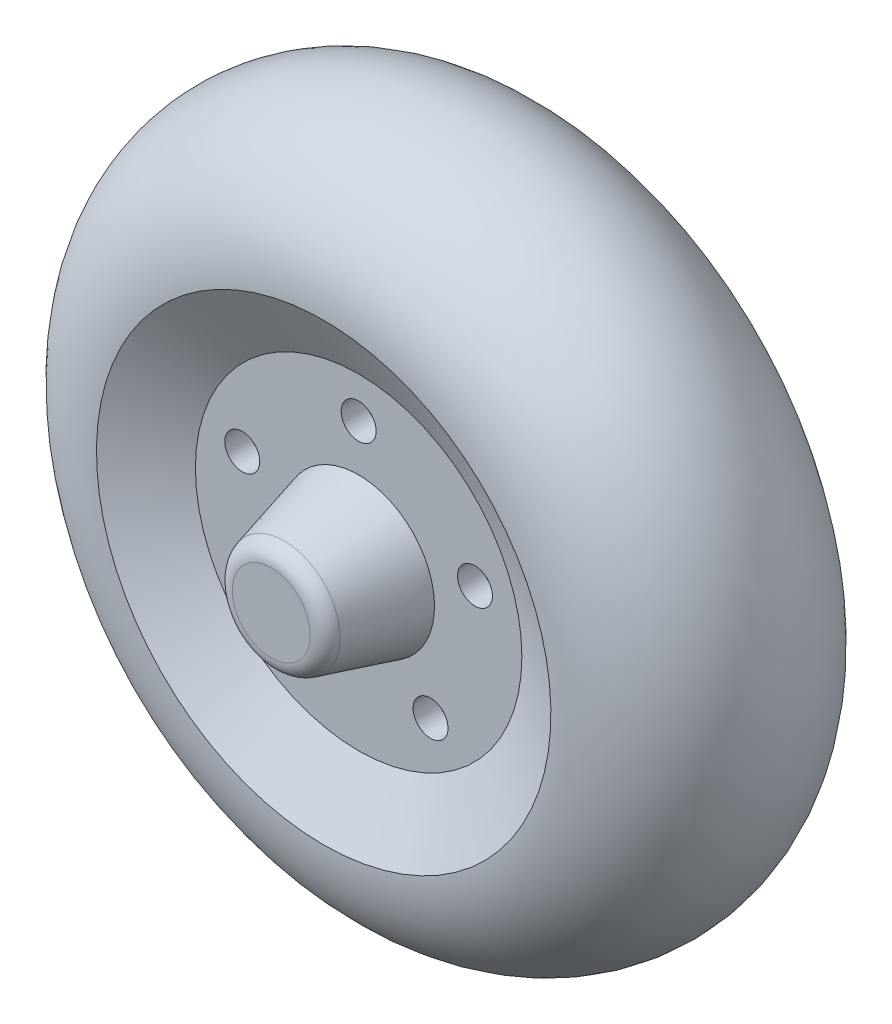
ISO-10303-21;
HEADER;
FILE_DESCRIPTION(('STEP AP214'),'2;1');
FILE_NAME('part.step','',(''),(''),'','','');
FILE_SCHEMA(('AUTOMOTIVE_DESIGN { 1 0 10303 214 1 1 1 1 }'));
ENDSEC;
DATA;
#1=APPLICATION_CONTEXT('core data for automotive mechanical design processes');
#2=APPLICATION_PROTOCOL_DEFINITION('international standard','automotive_design',2000,#1);
#3=PRODUCT_CONTEXT('',#1,'mechanical');
#4=PRODUCT('Part','Part','',(#3));
#5=PRODUCT_RELATED_PRODUCT_CATEGORY('part','',(#4));
#6=PRODUCT_DEFINITION_FORMATION('','',#4);
#7=PRODUCT_DEFINITION_CONTEXT('part definition',#1,'design');
#8=PRODUCT_DEFINITION('design','',#6,#7);
#9=PRODUCT_DEFINITION_SHAPE('','',#8);
#10=(LENGTH_UNIT() NAMED_UNIT(*) SI_UNIT(.MILLI.,.METRE.));
#11=(NAMED_UNIT(*) PLANE_ANGLE_UNIT() SI_UNIT($,.RADIAN.));
#12=(NAMED_UNIT(*) SI_UNIT($,.STERADIAN.) SOLID_ANGLE_UNIT());
#13=UNCERTAINTY_MEASURE_WITH_UNIT(LENGTH_MEASURE(1.E-05),#10,'distance_accuracy_value','');
#14=(GEOMETRIC_REPRESENTATION_CONTEXT(3) GLOBAL_UNCERTAINTY_ASSIGNED_CONTEXT((#13)) GLOBAL_UNIT_ASSIGNED_CONTEXT((#10,
#11,#12)) REPRESENTATION_CONTEXT('',''));
#15=CARTESIAN_POINT('',(0.,0.,0.));
#16=DIRECTION('',(0.,0.,1.));
#17=DIRECTION('',(1.,0.,0.));
#18=AXIS2_PLACEMENT_3D('',#15,#16,#17);
#19=CARTESIAN_POINT('',(0.,0.,25.));
#20=DIRECTION('',(0.,0.,-1.));
#21=DIRECTION('',(0.,1.,0.));
#22=AXIS2_PLACEMENT_3D('',#19,#20,#21);
#23=CONICAL_SURFACE('',#22,21.6987298107782,0.261799387799153);
#24=CARTESIAN_POINT('',(0.,0.,46.2940952255126));
#25=DIRECTION('',(0.,0.,1.));
#26=DIRECTION('',(0.,-1.,0.));
#27=AXIS2_PLACEMENT_3D('',#24,#25,#26);
#28=CIRCLE('',#27,15.9929941915506);
#29=CARTESIAN_POINT('',(0.,-15.9929941915506,46.2940952255126));
#30=VERTEX_POINT('',#29);
#31=EDGE_CURVE('E56',#30,#30,#28,.F.);
#32=ORIENTED_EDGE('',*,*,#31,.T.);
#33=EDGE_LOOP('',(#32));
#34=FACE_BOUND('',#33,.T.);
#35=CARTESIAN_POINT('',(0.,0.,25.));
#36=DIRECTION('',(0.,0.,1.));
#37=DIRECTION('',(0.,-1.,0.));
#38=AXIS2_PLACEMENT_3D('',#35,#36,#37);
#39=CIRCLE('',#38,21.6987298107782);
#40=CARTESIAN_POINT('',(0.,-21.6987298107782,25.));
#41=VERTEX_POINT('',#40);
#42=EDGE_CURVE('E117',#41,#41,#39,.T.);
#43=ORIENTED_EDGE('',*,*,#42,.T.);
#44=EDGE_LOOP('',(#43));
#45=FACE_BOUND('',#44,.T.);
#46=ADVANCED_FACE('F41',(#34,#45),#23,.T.);
#47=CARTESIAN_POINT('',(0.,15.,50.));
#48=DIRECTION('',(0.,0.,-1.));
#49=DIRECTION('',(0.,1.,0.));
#50=AXIS2_PLACEMENT_3D('',#47,#48,#49);
#51=PLANE('',#50);
#52=CARTESIAN_POINT('',(0.,0.,50.));
#53=DIRECTION('',(0.,0.,-1.));
#54=DIRECTION('',(0.,1.,0.));
#55=AXIS2_PLACEMENT_3D('',#52,#53,#54);
#56=CIRCLE('',#55,11.1633650601053);
#57=CARTESIAN_POINT('',(0.,11.1633650601052,50.));
#58=VERTEX_POINT('',#57);
#59=EDGE_CURVE('E173',#58,#58,#56,.F.);
#60=ORIENTED_EDGE('',*,*,#59,.T.);
#61=EDGE_LOOP('',(#60));
#62=FACE_BOUND('',#61,.T.);
#63=ADVANCED_FACE('F188',(#62),#51,.F.);
#64=CARTESIAN_POINT('',(0.,15.,-50.));
#65=DIRECTION('',(0.,0.,1.));
#66=DIRECTION('',(0.,-1.,0.));
#67=AXIS2_PLACEMENT_3D('',#64,#65,#66);
#68=PLANE('',#67);
#69=CARTESIAN_POINT('',(0.,0.,-50.));
#70=DIRECTION('',(0.,0.,1.));
#71=DIRECTION('',(0.,-1.,0.));
#72=AXIS2_PLACEMENT_3D('',#69,#70,#71);
#73=CIRCLE('',#72,11.1633650601052);
#74=CARTESIAN_POINT('',(0.,-11.1633650601052,-50.));
#75=VERTEX_POINT('',#74);
#76=EDGE_CURVE('E10',#75,#75,#73,.F.);
#77=ORIENTED_EDGE('',*,*,#76,.T.);
#78=EDGE_LOOP('',(#77));
#79=FACE_BOUND('',#78,.T.);
#80=ADVANCED_FACE('F190',(#79),#68,.F.);
#81=CARTESIAN_POINT('',(0.,0.,-50.));
#82=DIRECTION('',(0.,0.,1.));
#83=DIRECTION('',(0.,-1.,0.));
#84=AXIS2_PLACEMENT_3D('',#81,#82,#83);
#85=CONICAL_SURFACE('',#84,15.,0.261799387799154);
#86=CARTESIAN_POINT('',(0.,0.,-46.2940952255126));
#87=DIRECTION('',(0.,0.,-1.));
#88=DIRECTION('',(0.,1.,0.));
#89=AXIS2_PLACEMENT_3D('',#86,#87,#88);
#90=CIRCLE('',#89,15.9929941915505);
#91=CARTESIAN_POINT('',(0.,15.9929941915506,-46.2940952255126));
#92=VERTEX_POINT('',#91);
#93=EDGE_CURVE('E50',#92,#92,#90,.F.);
#94=ORIENTED_EDGE('',*,*,#93,.T.);
#95=EDGE_LOOP('',(#94));
#96=FACE_BOUND('',#95,.T.);
#97=CARTESIAN_POINT('',(0.,0.,-25.));
#98=DIRECTION('',(0.,0.,1.));
#99=DIRECTION('',(0.,-1.,0.));
#100=AXIS2_PLACEMENT_3D('',#97,#98,#99);
#101=CIRCLE('',#100,21.6987298107782);
#102=CARTESIAN_POINT('',(0.,-21.6987298107781,-25.));
#103=VERTEX_POINT('',#102);
#104=EDGE_CURVE('E137',#103,#103,#101,.T.);
#105=ORIENTED_EDGE('',*,*,#104,.F.);
#106=EDGE_LOOP('',(#105));
#107=FACE_BOUND('',#106,.T.);
#108=ADVANCED_FACE('F196',(#96,#107),#85,.T.);
#109=CARTESIAN_POINT('',(0.,46.6987298107782,-25.));
#110=DIRECTION('',(0.,0.,1.));
#111=DIRECTION('',(0.,-1.,0.));
#112=AXIS2_PLACEMENT_3D('',#109,#110,#111);
#113=PLANE('',#112);
#114=CARTESIAN_POINT('',(0.,35.,-25.));
#115=DIRECTION('',(0.,0.,1.));
#116=DIRECTION('',(0.,-1.,0.));
#117=AXIS2_PLACEMENT_3D('',#114,#115,#116);
#118=CIRCLE('',#117,5.);
#119=CARTESIAN_POINT('',(0.,30.,-25.));
#120=VERTEX_POINT('',#119);
#121=EDGE_CURVE('E113',#120,#120,#118,.T.);
#122=ORIENTED_EDGE('',*,*,#121,.T.);
#123=EDGE_LOOP('',(#122));
#124=FACE_BOUND('',#123,.T.);
#125=CARTESIAN_POINT('',(-33.2869780703304,10.8155948031231,-25.));
#126=DIRECTION('',(0.,0.,1.));
#127=DIRECTION('',(0.,-1.,0.));
#128=AXIS2_PLACEMENT_3D('',#125,#126,#127);
#129=CIRCLE('',#128,5.);
#130=CARTESIAN_POINT('',(-33.2869780703304,5.81559480312309,-25.));
#131=VERTEX_POINT('',#130);
#132=EDGE_CURVE('E101',#131,#131,#129,.T.);
#133=ORIENTED_EDGE('',*,*,#132,.T.);
#134=EDGE_LOOP('',(#133));
#135=FACE_BOUND('',#134,.T.);
#136=CARTESIAN_POINT('',(-20.5724838302364,-28.3155948031233,-25.));
#137=DIRECTION('',(0.,0.,1.));
#138=DIRECTION('',(0.,-1.,0.));
#139=AXIS2_PLACEMENT_3D('',#136,#137,#138);
#140=CIRCLE('',#139,5.);
#141=CARTESIAN_POINT('',(-20.5724838302364,-33.3155948031233,-25.));
#142=VERTEX_POINT('',#141);
#143=EDGE_CURVE('E80',#142,#142,#140,.T.);
#144=ORIENTED_EDGE('',*,*,#143,.T.);
#145=EDGE_LOOP('',(#144));
#146=FACE_BOUND('',#145,.T.);
#147=CARTESIAN_POINT('',(20.5724838302368,-28.315594803123,-25.));
#148=DIRECTION('',(0.,0.,1.));
#149=DIRECTION('',(0.,-1.,0.));
#150=AXIS2_PLACEMENT_3D('',#147,#148,#149);
#151=CIRCLE('',#150,5.);
#152=CARTESIAN_POINT('',(20.5724838302368,-33.315594803123,-25.));
#153=VERTEX_POINT('',#152);
#154=EDGE_CURVE('E75',#153,#153,#151,.T.);
#155=ORIENTED_EDGE('',*,*,#154,.T.);
#156=EDGE_LOOP('',(#155));
#157=FACE_BOUND('',#156,.T.);
#158=CARTESIAN_POINT('',(33.2869780703303,10.8155948031236,-25.));
#159=DIRECTION('',(0.,0.,1.));
#160=DIRECTION('',(0.,-1.,0.));
#161=AXIS2_PLACEMENT_3D('',#158,#159,#160);
#162=CIRCLE('',#161,5.);
#163=CARTESIAN_POINT('',(33.2869780703303,5.81559480312356,-25.));
#164=VERTEX_POINT('',#163);
#165=EDGE_CURVE('E70',#164,#164,#162,.T.);
#166=ORIENTED_EDGE('',*,*,#165,.T.);
#167=EDGE_LOOP('',(#166));
#168=FACE_BOUND('',#167,.T.);
#169=CARTESIAN_POINT('',(0.,0.,-25.));
#170=DIRECTION('',(0.,0.,1.));
#171=DIRECTION('',(0.,-1.,0.));
#172=AXIS2_PLACEMENT_3D('',#169,#170,#171);
#173=CIRCLE('',#172,46.6987298107782);
#174=CARTESIAN_POINT('',(0.,-46.6987298107782,-25.));
#175=VERTEX_POINT('',#174);
#176=EDGE_CURVE('E133',#175,#175,#173,.T.);
#177=ORIENTED_EDGE('',*,*,#176,.F.);
#178=EDGE_LOOP('',(#177));
#179=FACE_BOUND('',#178,.T.);
#180=ORIENTED_EDGE('',*,*,#104,.T.);
#181=EDGE_LOOP('',(#180));
#182=FACE_BOUND('',#181,.T.);
#183=ADVANCED_FACE('F239',(#124,#135,#146,#157,#168,#179,#182),#113,.F.);
#184=CARTESIAN_POINT('',(0.,0.,-25.));
#185=DIRECTION('',(0.,0.,-1.));
#186=DIRECTION('',(0.,1.,0.));
#187=AXIS2_PLACEMENT_3D('',#184,#185,#186);
#188=CONICAL_SURFACE('',#187,46.6987298107782,1.07071340709068);
#189=CARTESIAN_POINT('',(0.,0.,-35.));
#190=DIRECTION('',(0.,0.,1.));
#191=DIRECTION('',(0.,-1.,0.));
#192=AXIS2_PLACEMENT_3D('',#189,#190,#191);
#193=CIRCLE('',#192,65.);
#194=CARTESIAN_POINT('',(0.,-65.,-35.0000000000001));
#195=VERTEX_POINT('',#194);
#196=EDGE_CURVE('E129',#195,#195,#193,.T.);
#197=ORIENTED_EDGE('',*,*,#196,.F.);
#198=EDGE_LOOP('',(#197));
#199=FACE_BOUND('',#198,.T.);
#200=ORIENTED_EDGE('',*,*,#176,.T.);
#201=EDGE_LOOP('',(#200));
#202=FACE_BOUND('',#201,.T.);
#203=ADVANCED_FACE('F243',(#199,#202),#188,.F.);
#204=CARTESIAN_POINT('',(0.,0.,0.));
#205=DIRECTION('',(0.,0.,1.));
#206=DIRECTION('',(0.,-1.,0.));
#207=AXIS2_PLACEMENT_3D('',#204,#205,#206);
#208=TOROIDAL_SURFACE('',#207,65.,35.);
#209=CARTESIAN_POINT('',(0.,0.,34.9999999999999));
#210=DIRECTION('',(0.,0.,1.));
#211=DIRECTION('',(0.,-1.,0.));
#212=AXIS2_PLACEMENT_3D('',#209,#210,#211);
#213=CIRCLE('',#212,65.);
#214=CARTESIAN_POINT('',(0.,-65.0000000000001,34.9999999999999));
#215=VERTEX_POINT('',#214);
#216=EDGE_CURVE('E125',#215,#215,#213,.T.);
#217=ORIENTED_EDGE('',*,*,#216,.F.);
#218=EDGE_LOOP('',(#217));
#219=FACE_BOUND('',#218,.T.);
#220=ORIENTED_EDGE('',*,*,#196,.T.);
#221=EDGE_LOOP('',(#220));
#222=FACE_BOUND('',#221,.T.);
#223=ADVANCED_FACE('F247',(#219,#222),#208,.T.);
#224=CARTESIAN_POINT('',(0.,0.,34.9999999999999));
#225=DIRECTION('',(0.,0.,1.));
#226=DIRECTION('',(0.,-1.,0.));
#227=AXIS2_PLACEMENT_3D('',#224,#225,#226);
#228=CONICAL_SURFACE('',#227,65.,1.07071340709068);
#229=CARTESIAN_POINT('',(0.,0.,25.));
#230=DIRECTION('',(0.,0.,1.));
#231=DIRECTION('',(0.,-1.,0.));
#232=AXIS2_PLACEMENT_3D('',#229,#230,#231);
#233=CIRCLE('',#232,46.6987298107782);
#234=CARTESIAN_POINT('',(0.,-46.6987298107782,24.9999999999999));
#235=VERTEX_POINT('',#234);
#236=EDGE_CURVE('E121',#235,#235,#233,.T.);
#237=ORIENTED_EDGE('',*,*,#236,.F.);
#238=EDGE_LOOP('',(#237));
#239=FACE_BOUND('',#238,.T.);
#240=ORIENTED_EDGE('',*,*,#216,.T.);
#241=EDGE_LOOP('',(#240));
#242=FACE_BOUND('',#241,.T.);
#243=ADVANCED_FACE('F251',(#239,#242),#228,.F.);
#244=CARTESIAN_POINT('',(0.,46.6987298107782,25.));
#245=DIRECTION('',(0.,0.,-1.));
#246=DIRECTION('',(0.,1.,0.));
#247=AXIS2_PLACEMENT_3D('',#244,#245,#246);
#248=PLANE('',#247);
#249=CARTESIAN_POINT('',(0.,35.,25.));
#250=DIRECTION('',(0.,0.,-1.));
#251=DIRECTION('',(0.,1.,0.));
#252=AXIS2_PLACEMENT_3D('',#249,#250,#251);
#253=CIRCLE('',#252,5.);
#254=CARTESIAN_POINT('',(0.,40.,25.));
#255=VERTEX_POINT('',#254);
#256=EDGE_CURVE('E109',#255,#255,#253,.T.);
#257=ORIENTED_EDGE('',*,*,#256,.T.);
#258=EDGE_LOOP('',(#257));
#259=FACE_BOUND('',#258,.T.);
#260=CARTESIAN_POINT('',(-33.2869780703304,10.815594803123,25.));
#261=DIRECTION('',(0.,0.,-1.));
#262=DIRECTION('',(0.,1.,0.));
#263=AXIS2_PLACEMENT_3D('',#260,#261,#262);
#264=CIRCLE('',#263,5.);
#265=CARTESIAN_POINT('',(-33.2869780703304,15.815594803123,25.));
#266=VERTEX_POINT('',#265);
#267=EDGE_CURVE('E86',#266,#266,#264,.T.);
#268=ORIENTED_EDGE('',*,*,#267,.T.);
#269=EDGE_LOOP('',(#268));
#270=FACE_BOUND('',#269,.T.);
#271=CARTESIAN_POINT('',(-20.5724838302364,-28.3155948031233,24.9999999999999));
#272=DIRECTION('',(0.,0.,-1.));
#273=DIRECTION('',(0.,1.,0.));
#274=AXIS2_PLACEMENT_3D('',#271,#272,#273);
#275=CIRCLE('',#274,5.);
#276=CARTESIAN_POINT('',(-20.5724838302364,-23.3155948031233,24.9999999999999));
#277=VERTEX_POINT('',#276);
#278=EDGE_CURVE('E89',#277,#277,#275,.T.);
#279=ORIENTED_EDGE('',*,*,#278,.T.);
#280=EDGE_LOOP('',(#279));
#281=FACE_BOUND('',#280,.T.);
#282=CARTESIAN_POINT('',(20.5724838302368,-28.315594803123,24.9999999999999));
#283=DIRECTION('',(0.,0.,-1.));
#284=DIRECTION('',(0.,1.,0.));
#285=AXIS2_PLACEMENT_3D('',#282,#283,#284);
#286=CIRCLE('',#285,5.);
#287=CARTESIAN_POINT('',(20.5724838302368,-23.315594803123,24.9999999999999));
#288=VERTEX_POINT('',#287);
#289=EDGE_CURVE('E305',#288,#288,#286,.T.);
#290=ORIENTED_EDGE('',*,*,#289,.T.);
#291=EDGE_LOOP('',(#290));
#292=FACE_BOUND('',#291,.T.);
#293=CARTESIAN_POINT('',(33.2869780703303,10.8155948031235,25.));
#294=DIRECTION('',(0.,0.,-1.));
#295=DIRECTION('',(0.,1.,0.));
#296=AXIS2_PLACEMENT_3D('',#293,#294,#295);
#297=CIRCLE('',#296,5.);
#298=CARTESIAN_POINT('',(33.2869780703303,15.8155948031235,25.));
#299=VERTEX_POINT('',#298);
#300=EDGE_CURVE('E309',#299,#299,#297,.T.);
#301=ORIENTED_EDGE('',*,*,#300,.T.);
#302=EDGE_LOOP('',(#301));
#303=FACE_BOUND('',#302,.T.);
#304=ORIENTED_EDGE('',*,*,#42,.F.);
#305=EDGE_LOOP('',(#304));
#306=FACE_BOUND('',#305,.T.);
#307=ORIENTED_EDGE('',*,*,#236,.T.);
#308=EDGE_LOOP('',(#307));
#309=FACE_BOUND('',#308,.T.);
#310=ADVANCED_FACE('F185',(#259,#270,#281,#292,#303,#306,#309),#248,.F.);
#311=CARTESIAN_POINT('',(0.,0.,45.));
#312=DIRECTION('',(0.,0.,-1.));
#313=DIRECTION('',(0.,1.,0.));
#314=AXIS2_PLACEMENT_3D('',#311,#312,#313);
#315=TOROIDAL_SURFACE('',#314,11.1633650601053,5.);
#316=ORIENTED_EDGE('',*,*,#31,.F.);
#317=EDGE_LOOP('',(#316));
#318=FACE_BOUND('',#317,.T.);
#319=ORIENTED_EDGE('',*,*,#59,.F.);
#320=EDGE_LOOP('',(#319));
#321=FACE_BOUND('',#320,.T.);
#322=ADVANCED_FACE('F182',(#318,#321),#315,.T.);
#323=CARTESIAN_POINT('',(0.,0.,-45.));
#324=DIRECTION('',(0.,0.,1.));
#325=DIRECTION('',(0.,-1.,0.));
#326=AXIS2_PLACEMENT_3D('',#323,#324,#325);
#327=TOROIDAL_SURFACE('',#326,11.1633650601052,5.);
#328=ORIENTED_EDGE('',*,*,#76,.F.);
#329=EDGE_LOOP('',(#328));
#330=FACE_BOUND('',#329,.T.);
#331=ORIENTED_EDGE('',*,*,#93,.F.);
#332=EDGE_LOOP('',(#331));
#333=FACE_BOUND('',#332,.T.);
#334=ADVANCED_FACE('F43',(#330,#333),#327,.T.);
#335=CARTESIAN_POINT('',(33.2869780703303,10.8155948031235,50.0000000000001));
#336=DIRECTION('',(0.,0.,-1.));
#337=DIRECTION('',(0.,1.,0.));
#338=AXIS2_PLACEMENT_3D('',#335,#336,#337);
#339=CYLINDRICAL_SURFACE('',#338,5.);
#340=CARTESIAN_POINT('',(33.2869780703303,10.8155948031236,-18.));
#341=DIRECTION('',(0.,0.,-1.));
#342=DIRECTION('',(0.,1.,0.));
#343=AXIS2_PLACEMENT_3D('',#340,#341,#342);
#344=CIRCLE('',#343,5.);
#345=CARTESIAN_POINT('',(33.2869780703303,15.8155948031236,-18.));
#346=VERTEX_POINT('',#345);
#347=EDGE_CURVE('E60',#346,#346,#344,.T.);
#348=ORIENTED_EDGE('',*,*,#347,.F.);
#349=EDGE_LOOP('',(#348));
#350=FACE_BOUND('',#349,.T.);
#351=ORIENTED_EDGE('',*,*,#165,.F.);
#352=EDGE_LOOP('',(#351));
#353=FACE_BOUND('',#352,.T.);
#354=ADVANCED_FACE('F259',(#350,#353),#339,.F.);
#355=CARTESIAN_POINT('',(20.5724838302368,-28.315594803123,50.0000000000001));
#356=DIRECTION('',(0.,0.,-1.));
#357=DIRECTION('',(0.,1.,0.));
#358=AXIS2_PLACEMENT_3D('',#355,#356,#357);
#359=CYLINDRICAL_SURFACE('',#358,5.);
#360=CARTESIAN_POINT('',(20.5724838302368,-28.315594803123,-18.));
#361=DIRECTION('',(0.,0.,-1.));
#362=DIRECTION('',(0.,1.,0.));
#363=AXIS2_PLACEMENT_3D('',#360,#361,#362);
#364=CIRCLE('',#363,5.);
#365=CARTESIAN_POINT('',(20.5724838302368,-23.315594803123,-18.));
#366=VERTEX_POINT('',#365);
#367=EDGE_CURVE('E65',#366,#366,#364,.T.);
#368=ORIENTED_EDGE('',*,*,#367,.F.);
#369=EDGE_LOOP('',(#368));
#370=FACE_BOUND('',#369,.T.);
#371=ORIENTED_EDGE('',*,*,#154,.F.);
#372=EDGE_LOOP('',(#371));
#373=FACE_BOUND('',#372,.T.);
#374=ADVANCED_FACE('F262',(#370,#373),#359,.F.);
#375=CARTESIAN_POINT('',(-20.5724838302364,-28.3155948031233,50.0000000000001));
#376=DIRECTION('',(0.,0.,-1.));
#377=DIRECTION('',(0.,1.,0.));
#378=AXIS2_PLACEMENT_3D('',#375,#376,#377);
#379=CYLINDRICAL_SURFACE('',#378,5.);
#380=CARTESIAN_POINT('',(-20.5724838302364,-28.3155948031233,-18.));
#381=DIRECTION('',(0.,0.,-1.));
#382=DIRECTION('',(0.,1.,0.));
#383=AXIS2_PLACEMENT_3D('',#380,#381,#382);
#384=CIRCLE('',#383,5.);
#385=CARTESIAN_POINT('',(-20.5724838302364,-23.3155948031233,-18.));
#386=VERTEX_POINT('',#385);
#387=EDGE_CURVE('E71',#386,#386,#384,.T.);
#388=ORIENTED_EDGE('',*,*,#387,.F.);
#389=EDGE_LOOP('',(#388));
#390=FACE_BOUND('',#389,.T.);
#391=ORIENTED_EDGE('',*,*,#143,.F.);
#392=EDGE_LOOP('',(#391));
#393=FACE_BOUND('',#392,.T.);
#394=ADVANCED_FACE('F267',(#390,#393),#379,.F.);
#395=CARTESIAN_POINT('',(-33.2869780703304,10.815594803123,50.0000000000001));
#396=DIRECTION('',(0.,0.,-1.));
#397=DIRECTION('',(0.,1.,0.));
#398=AXIS2_PLACEMENT_3D('',#395,#396,#397);
#399=CYLINDRICAL_SURFACE('',#398,5.);
#400=CARTESIAN_POINT('',(-33.2869780703304,10.8155948031231,-18.));
#401=DIRECTION('',(0.,0.,-1.));
#402=DIRECTION('',(0.,1.,0.));
#403=AXIS2_PLACEMENT_3D('',#400,#401,#402);
#404=CIRCLE('',#403,5.);
#405=CARTESIAN_POINT('',(-33.2869780703304,15.8155948031231,-18.));
#406=VERTEX_POINT('',#405);
#407=EDGE_CURVE('E76',#406,#406,#404,.T.);
#408=ORIENTED_EDGE('',*,*,#407,.F.);
#409=EDGE_LOOP('',(#408));
#410=FACE_BOUND('',#409,.T.);
#411=ORIENTED_EDGE('',*,*,#132,.F.);
#412=EDGE_LOOP('',(#411));
#413=FACE_BOUND('',#412,.T.);
#414=ADVANCED_FACE('F272',(#410,#413),#399,.F.);
#415=CARTESIAN_POINT('',(0.,35.,50.0000000000001));
#416=DIRECTION('',(0.,0.,-1.));
#417=DIRECTION('',(0.,1.,0.));
#418=AXIS2_PLACEMENT_3D('',#415,#416,#417);
#419=CYLINDRICAL_SURFACE('',#418,5.);
#420=CARTESIAN_POINT('',(0.,35.,-18.));
#421=DIRECTION('',(0.,0.,-1.));
#422=DIRECTION('',(0.,1.,0.));
#423=AXIS2_PLACEMENT_3D('',#420,#421,#422);
#424=CIRCLE('',#423,5.);
#425=CARTESIAN_POINT('',(0.,40.,-18.));
#426=VERTEX_POINT('',#425);
#427=EDGE_CURVE('E45',#426,#426,#424,.T.);
#428=ORIENTED_EDGE('',*,*,#427,.F.);
#429=EDGE_LOOP('',(#428));
#430=FACE_BOUND('',#429,.T.);
#431=ORIENTED_EDGE('',*,*,#121,.F.);
#432=EDGE_LOOP('',(#431));
#433=FACE_BOUND('',#432,.T.);
#434=ADVANCED_FACE('F277',(#430,#433),#419,.F.);
#435=CARTESIAN_POINT('',(33.2869780703303,10.8155948031235,18.));
#436=DIRECTION('',(0.,0.,1.));
#437=DIRECTION('',(0.,-1.,0.));
#438=AXIS2_PLACEMENT_3D('',#435,#436,#437);
#439=CIRCLE('',#438,5.);
#440=CARTESIAN_POINT('',(33.2869780703303,5.81559480312353,18.));
#441=VERTEX_POINT('',#440);
#442=EDGE_CURVE('E64',#441,#441,#439,.T.);
#443=ORIENTED_EDGE('',*,*,#442,.F.);
#444=EDGE_LOOP('',(#443));
#445=FACE_BOUND('',#444,.T.);
#446=ORIENTED_EDGE('',*,*,#300,.F.);
#447=EDGE_LOOP('',(#446));
#448=FACE_BOUND('',#447,.T.);
#449=ADVANCED_FACE('F264',(#445,#448),#339,.F.);
#450=CARTESIAN_POINT('',(20.5724838302368,-28.315594803123,17.9999999999999));
#451=DIRECTION('',(0.,0.,1.));
#452=DIRECTION('',(0.,-1.,0.));
#453=AXIS2_PLACEMENT_3D('',#450,#451,#452);
#454=CIRCLE('',#453,5.);
#455=CARTESIAN_POINT('',(20.5724838302368,-33.315594803123,17.9999999999999));
#456=VERTEX_POINT('',#455);
#457=EDGE_CURVE('E69',#456,#456,#454,.T.);
#458=ORIENTED_EDGE('',*,*,#457,.F.);
#459=EDGE_LOOP('',(#458));
#460=FACE_BOUND('',#459,.T.);
#461=ORIENTED_EDGE('',*,*,#289,.F.);
#462=EDGE_LOOP('',(#461));
#463=FACE_BOUND('',#462,.T.);
#464=ADVANCED_FACE('F269',(#460,#463),#359,.F.);
#465=CARTESIAN_POINT('',(-20.5724838302364,-28.3155948031233,17.9999999999999));
#466=DIRECTION('',(0.,0.,1.));
#467=DIRECTION('',(0.,-1.,0.));
#468=AXIS2_PLACEMENT_3D('',#465,#466,#467);
#469=CIRCLE('',#468,5.);
#470=CARTESIAN_POINT('',(-20.5724838302364,-33.3155948031233,17.9999999999999));
#471=VERTEX_POINT('',#470);
#472=EDGE_CURVE('E74',#471,#471,#469,.T.);
#473=ORIENTED_EDGE('',*,*,#472,.F.);
#474=EDGE_LOOP('',(#473));
#475=FACE_BOUND('',#474,.T.);
#476=ORIENTED_EDGE('',*,*,#278,.F.);
#477=EDGE_LOOP('',(#476));
#478=FACE_BOUND('',#477,.T.);
#479=ADVANCED_FACE('F274',(#475,#478),#379,.F.);
#480=CARTESIAN_POINT('',(-33.2869780703304,10.8155948031231,18.));
#481=DIRECTION('',(0.,0.,1.));
#482=DIRECTION('',(0.,-1.,0.));
#483=AXIS2_PLACEMENT_3D('',#480,#481,#482);
#484=CIRCLE('',#483,5.);
#485=CARTESIAN_POINT('',(-33.2869780703304,5.81559480312306,18.));
#486=VERTEX_POINT('',#485);
#487=EDGE_CURVE('E79',#486,#486,#484,.T.);
#488=ORIENTED_EDGE('',*,*,#487,.F.);
#489=EDGE_LOOP('',(#488));
#490=FACE_BOUND('',#489,.T.);
#491=ORIENTED_EDGE('',*,*,#267,.F.);
#492=EDGE_LOOP('',(#491));
#493=FACE_BOUND('',#492,.T.);
#494=ADVANCED_FACE('F279',(#490,#493),#399,.F.);
#495=CARTESIAN_POINT('',(0.,35.,18.));
#496=DIRECTION('',(0.,0.,1.));
#497=DIRECTION('',(0.,-1.,0.));
#498=AXIS2_PLACEMENT_3D('',#495,#496,#497);
#499=CIRCLE('',#498,5.);
#500=CARTESIAN_POINT('',(0.,30.,18.));
#501=VERTEX_POINT('',#500);
#502=EDGE_CURVE('E105',#501,#501,#499,.T.);
#503=ORIENTED_EDGE('',*,*,#502,.F.);
#504=EDGE_LOOP('',(#503));
#505=FACE_BOUND('',#504,.T.);
#506=ORIENTED_EDGE('',*,*,#256,.F.);
#507=EDGE_LOOP('',(#506));
#508=FACE_BOUND('',#507,.T.);
#509=ADVANCED_FACE('F204',(#505,#508),#419,.F.);
#510=CARTESIAN_POINT('',(0.,9.6287110841473,43.));
#511=DIRECTION('',(0.,0.,1.));
#512=DIRECTION('',(0.,-1.,0.));
#513=AXIS2_PLACEMENT_3D('',#510,#511,#512);
#514=PLANE('',#513);
#515=CARTESIAN_POINT('',(0.,0.,43.));
#516=DIRECTION('',(0.,0.,1.));
#517=DIRECTION('',(0.,-1.,0.));
#518=AXIS2_PLACEMENT_3D('',#515,#516,#517);
#519=CIRCLE('',#518,9.62871108414734);
#520=CARTESIAN_POINT('',(0.,-9.62871108414737,43.));
#521=VERTEX_POINT('',#520);
#522=EDGE_CURVE('E169',#521,#521,#519,.T.);
#523=ORIENTED_EDGE('',*,*,#522,.F.);
#524=EDGE_LOOP('',(#523));
#525=FACE_BOUND('',#524,.T.);
#526=ADVANCED_FACE('F200',(#525),#514,.F.);
#527=CARTESIAN_POINT('',(0.,0.,43.));
#528=DIRECTION('',(0.,0.,-1.));
#529=DIRECTION('',(0.,1.,0.));
#530=AXIS2_PLACEMENT_3D('',#527,#528,#529);
#531=CONICAL_SURFACE('',#530,9.62871108414734,0.261799387799153);
#532=CARTESIAN_POINT('',(0.,0.,18.));
#533=DIRECTION('',(0.,0.,1.));
#534=DIRECTION('',(0.,-1.,0.));
#535=AXIS2_PLACEMENT_3D('',#532,#533,#534);
#536=CIRCLE('',#535,16.3274408949255);
#537=CARTESIAN_POINT('',(0.,-16.3274408949255,18.));
#538=VERTEX_POINT('',#537);
#539=EDGE_CURVE('E165',#538,#538,#536,.T.);
#540=ORIENTED_EDGE('',*,*,#539,.F.);
#541=EDGE_LOOP('',(#540));
#542=FACE_BOUND('',#541,.T.);
#543=ORIENTED_EDGE('',*,*,#522,.T.);
#544=EDGE_LOOP('',(#543));
#545=FACE_BOUND('',#544,.T.);
#546=ADVANCED_FACE('F203',(#542,#545),#531,.F.);
#547=CARTESIAN_POINT('',(0.,48.4864324036936,18.));
#548=DIRECTION('',(0.,0.,1.));
#549=DIRECTION('',(0.,-1.,0.));
#550=AXIS2_PLACEMENT_3D('',#547,#548,#549);
#551=PLANE('',#550);
#552=ORIENTED_EDGE('',*,*,#502,.T.);
#553=EDGE_LOOP('',(#552));
#554=FACE_BOUND('',#553,.T.);
#555=ORIENTED_EDGE('',*,*,#487,.T.);
#556=EDGE_LOOP('',(#555));
#557=FACE_BOUND('',#556,.T.);
#558=ORIENTED_EDGE('',*,*,#472,.T.);
#559=EDGE_LOOP('',(#558));
#560=FACE_BOUND('',#559,.T.);
#561=ORIENTED_EDGE('',*,*,#457,.T.);
#562=EDGE_LOOP('',(#561));
#563=FACE_BOUND('',#562,.T.);
#564=ORIENTED_EDGE('',*,*,#442,.T.);
#565=EDGE_LOOP('',(#564));
#566=FACE_BOUND('',#565,.T.);
#567=CARTESIAN_POINT('',(0.,0.,18.));
#568=DIRECTION('',(0.,0.,1.));
#569=DIRECTION('',(0.,-1.,0.));
#570=AXIS2_PLACEMENT_3D('',#567,#568,#569);
#571=CIRCLE('',#570,48.4864324036936);
#572=CARTESIAN_POINT('',(0.,-48.4864324036936,17.9999999999999));
#573=VERTEX_POINT('',#572);
#574=EDGE_CURVE('E161',#573,#573,#571,.T.);
#575=ORIENTED_EDGE('',*,*,#574,.F.);
#576=EDGE_LOOP('',(#575));
#577=FACE_BOUND('',#576,.T.);
#578=ORIENTED_EDGE('',*,*,#539,.T.);
#579=EDGE_LOOP('',(#578));
#580=FACE_BOUND('',#579,.T.);
#581=ADVANCED_FACE('F208',(#554,#557,#560,#563,#566,#577,#580),#551,.F.);
#582=CARTESIAN_POINT('',(0.,0.,18.));
#583=DIRECTION('',(0.,0.,1.));
#584=DIRECTION('',(0.,-1.,0.));
#585=AXIS2_PLACEMENT_3D('',#582,#583,#584);
#586=CONICAL_SURFACE('',#585,48.4864324036936,1.07071340709068);
#587=CARTESIAN_POINT('',(0.,0.,27.9487185518618));
#588=DIRECTION('',(0.,0.,1.));
#589=DIRECTION('',(0.,-1.,0.));
#590=AXIS2_PLACEMENT_3D('',#587,#588,#589);
#591=CIRCLE('',#590,66.6938510291084);
#592=CARTESIAN_POINT('',(0.,-66.6938510291084,27.9487185518617));
#593=VERTEX_POINT('',#592);
#594=EDGE_CURVE('E157',#593,#593,#591,.T.);
#595=ORIENTED_EDGE('',*,*,#594,.F.);
#596=EDGE_LOOP('',(#595));
#597=FACE_BOUND('',#596,.T.);
#598=ORIENTED_EDGE('',*,*,#574,.T.);
#599=EDGE_LOOP('',(#598));
#600=FACE_BOUND('',#599,.T.);
#601=ADVANCED_FACE('F212',(#597,#600),#586,.T.);
#602=CARTESIAN_POINT('',(0.,0.,0.));
#603=DIRECTION('',(0.,0.,1.));
#604=DIRECTION('',(0.,-1.,0.));
#605=AXIS2_PLACEMENT_3D('',#602,#603,#604);
#606=TOROIDAL_SURFACE('',#605,65.,28.);
#607=CARTESIAN_POINT('',(0.,0.,-27.9487185518619));
#608=DIRECTION('',(0.,0.,1.));
#609=DIRECTION('',(0.,-1.,0.));
#610=AXIS2_PLACEMENT_3D('',#607,#608,#609);
#611=CIRCLE('',#610,66.6938510291084);
#612=CARTESIAN_POINT('',(0.,-66.6938510291084,-27.948718551862));
#613=VERTEX_POINT('',#612);
#614=EDGE_CURVE('E153',#613,#613,#611,.T.);
#615=ORIENTED_EDGE('',*,*,#614,.F.);
#616=EDGE_LOOP('',(#615));
#617=FACE_BOUND('',#616,.T.);
#618=ORIENTED_EDGE('',*,*,#594,.T.);
#619=EDGE_LOOP('',(#618));
#620=FACE_BOUND('',#619,.T.);
#621=ADVANCED_FACE('F216',(#617,#620),#606,.F.);
#622=CARTESIAN_POINT('',(0.,0.,-27.9487185518619));
#623=DIRECTION('',(0.,0.,-1.));
#624=DIRECTION('',(0.,1.,0.));
#625=AXIS2_PLACEMENT_3D('',#622,#623,#624);
#626=CONICAL_SURFACE('',#625,66.6938510291084,1.07071340709068);
#627=CARTESIAN_POINT('',(0.,0.,-18.));
#628=DIRECTION('',(0.,0.,1.));
#629=DIRECTION('',(0.,-1.,0.));
#630=AXIS2_PLACEMENT_3D('',#627,#628,#629);
#631=CIRCLE('',#630,48.4864324036936);
#632=CARTESIAN_POINT('',(0.,-48.4864324036936,-18.));
#633=VERTEX_POINT('',#632);
#634=EDGE_CURVE('E149',#633,#633,#631,.T.);
#635=ORIENTED_EDGE('',*,*,#634,.F.);
#636=EDGE_LOOP('',(#635));
#637=FACE_BOUND('',#636,.T.);
#638=ORIENTED_EDGE('',*,*,#614,.T.);
#639=EDGE_LOOP('',(#638));
#640=FACE_BOUND('',#639,.T.);
#641=ADVANCED_FACE('F220',(#637,#640),#626,.T.);
#642=CARTESIAN_POINT('',(0.,48.4864324036936,-18.));
#643=DIRECTION('',(0.,0.,-1.));
#644=DIRECTION('',(0.,1.,0.));
#645=AXIS2_PLACEMENT_3D('',#642,#643,#644);
#646=PLANE('',#645);
#647=ORIENTED_EDGE('',*,*,#427,.T.);
#648=EDGE_LOOP('',(#647));
#649=FACE_BOUND('',#648,.T.);
#650=ORIENTED_EDGE('',*,*,#407,.T.);
#651=EDGE_LOOP('',(#650));
#652=FACE_BOUND('',#651,.T.);
#653=ORIENTED_EDGE('',*,*,#387,.T.);
#654=EDGE_LOOP('',(#653));
#655=FACE_BOUND('',#654,.T.);
#656=ORIENTED_EDGE('',*,*,#367,.T.);
#657=EDGE_LOOP('',(#656));
#658=FACE_BOUND('',#657,.T.);
#659=ORIENTED_EDGE('',*,*,#347,.T.);
#660=EDGE_LOOP('',(#659));
#661=FACE_BOUND('',#660,.T.);
#662=CARTESIAN_POINT('',(0.,0.,-18.));
#663=DIRECTION('',(0.,0.,1.));
#664=DIRECTION('',(0.,-1.,0.));
#665=AXIS2_PLACEMENT_3D('',#662,#663,#664);
#666=CIRCLE('',#665,16.3274408949255);
#667=CARTESIAN_POINT('',(0.,-16.3274408949255,-18.));
#668=VERTEX_POINT('',#667);
#669=EDGE_CURVE('E145',#668,#668,#666,.T.);
#670=ORIENTED_EDGE('',*,*,#669,.F.);
#671=EDGE_LOOP('',(#670));
#672=FACE_BOUND('',#671,.T.);
#673=ORIENTED_EDGE('',*,*,#634,.T.);
#674=EDGE_LOOP('',(#673));
#675=FACE_BOUND('',#674,.T.);
#676=ADVANCED_FACE('F224',(#649,#652,#655,#658,#661,#672,#675),#646,.F.);
#677=CARTESIAN_POINT('',(0.,0.,-18.));
#678=DIRECTION('',(0.,0.,1.));
#679=DIRECTION('',(0.,-1.,0.));
#680=AXIS2_PLACEMENT_3D('',#677,#678,#679);
#681=CONICAL_SURFACE('',#680,16.3274408949255,0.261799387799154);
#682=CARTESIAN_POINT('',(0.,0.,-43.));
#683=DIRECTION('',(0.,0.,1.));
#684=DIRECTION('',(0.,-1.,0.));
#685=AXIS2_PLACEMENT_3D('',#682,#683,#684);
#686=CIRCLE('',#685,9.62871108414729);
#687=CARTESIAN_POINT('',(0.,-9.62871108414725,-43.));
#688=VERTEX_POINT('',#687);
#689=EDGE_CURVE('E141',#688,#688,#686,.T.);
#690=ORIENTED_EDGE('',*,*,#689,.F.);
#691=EDGE_LOOP('',(#690));
#692=FACE_BOUND('',#691,.T.);
#693=ORIENTED_EDGE('',*,*,#669,.T.);
#694=EDGE_LOOP('',(#693));
#695=FACE_BOUND('',#694,.T.);
#696=ADVANCED_FACE('F228',(#692,#695),#681,.F.);
#697=CARTESIAN_POINT('',(0.,9.62871108414732,-43.));
#698=DIRECTION('',(0.,0.,-1.));
#699=DIRECTION('',(0.,1.,0.));
#700=AXIS2_PLACEMENT_3D('',#697,#698,#699);
#701=PLANE('',#700);
#702=ORIENTED_EDGE('',*,*,#689,.T.);
#703=EDGE_LOOP('',(#702));
#704=FACE_BOUND('',#703,.T.);
#705=ADVANCED_FACE('F232',(#704),#701,.F.);
#706=CLOSED_SHELL('',(#46,#63,#80,#108,#183,#203,#223,#243,#310,#322,#334,#354,#374,#394,#414,
#434,#449,#464,#479,#494,#509,#526,#546,#581,#601,#621,#641,#676,#696,#705));
#707=MANIFOLD_SOLID_BREP('B2',#706);
#708=ADVANCED_BREP_SHAPE_REPRESENTATION('',(#18,#707),#14);
#709=SHAPE_DEFINITION_REPRESENTATION(#9,#708);
ENDSEC;
END-ISO-10303-21;
